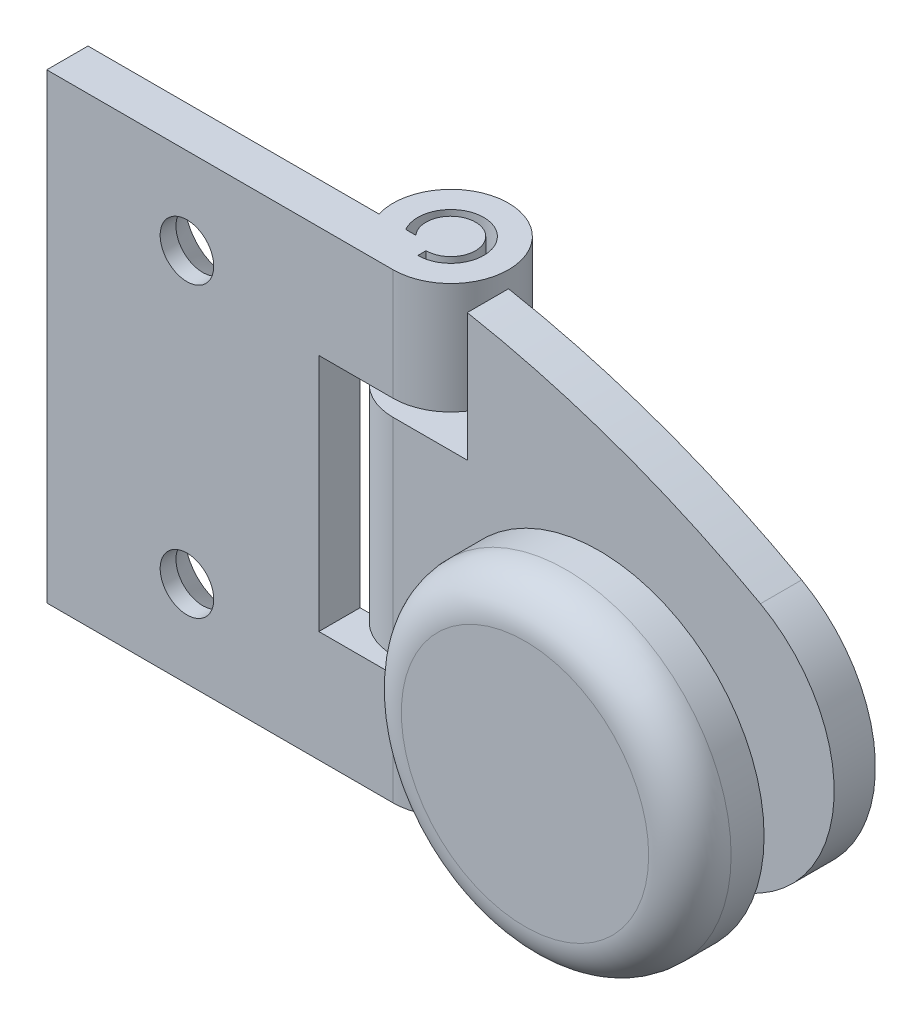
ISO-10303-21;
HEADER;
FILE_DESCRIPTION(('STEP AP214'),'2;1');
FILE_NAME('part.step','',(''),(''),'','','');
FILE_SCHEMA(('AUTOMOTIVE_DESIGN { 1 0 10303 214 1 1 1 1 }'));
ENDSEC;
DATA;
#1=APPLICATION_CONTEXT('core data for automotive mechanical design processes');
#2=APPLICATION_PROTOCOL_DEFINITION('international standard','automotive_design',2000,#1);
#3=PRODUCT_CONTEXT('',#1,'mechanical');
#4=PRODUCT('Part','Part','',(#3));
#5=PRODUCT_RELATED_PRODUCT_CATEGORY('part','',(#4));
#6=PRODUCT_DEFINITION_FORMATION('','',#4);
#7=PRODUCT_DEFINITION_CONTEXT('part definition',#1,'design');
#8=PRODUCT_DEFINITION('design','',#6,#7);
#9=PRODUCT_DEFINITION_SHAPE('','',#8);
#10=(LENGTH_UNIT() NAMED_UNIT(*) SI_UNIT(.MILLI.,.METRE.));
#11=(NAMED_UNIT(*) PLANE_ANGLE_UNIT() SI_UNIT($,.RADIAN.));
#12=(NAMED_UNIT(*) SI_UNIT($,.STERADIAN.) SOLID_ANGLE_UNIT());
#13=UNCERTAINTY_MEASURE_WITH_UNIT(LENGTH_MEASURE(1.E-05),#10,'distance_accuracy_value','');
#14=(GEOMETRIC_REPRESENTATION_CONTEXT(3) GLOBAL_UNCERTAINTY_ASSIGNED_CONTEXT((#13)) GLOBAL_UNIT_ASSIGNED_CONTEXT((#10,
#11,#12)) REPRESENTATION_CONTEXT('',''));
#15=CARTESIAN_POINT('',(0.,0.,0.));
#16=DIRECTION('',(0.,0.,1.));
#17=DIRECTION('',(1.,0.,0.));
#18=AXIS2_PLACEMENT_3D('',#15,#16,#17);
#19=CARTESIAN_POINT('',(0.,28.,2.));
#20=DIRECTION('',(0.,0.,-1.));
#21=DIRECTION('',(-1.,0.,0.));
#22=AXIS2_PLACEMENT_3D('',#19,#20,#21);
#23=PLANE('',#22);
#24=CARTESIAN_POINT('',(-25.,-17.5,2.));
#25=DIRECTION('',(0.,0.,-1.));
#26=DIRECTION('',(-1.,0.,0.));
#27=AXIS2_PLACEMENT_3D('',#24,#25,#26);
#28=CIRCLE('',#27,5.25);
#29=CARTESIAN_POINT('',(-30.25,-17.5,2.));
#30=VERTEX_POINT('',#29);
#31=EDGE_CURVE('E50',#30,#30,#28,.F.);
#32=ORIENTED_EDGE('',*,*,#31,.T.);
#33=EDGE_LOOP('',(#32));
#34=FACE_BOUND('',#33,.T.);
#35=CARTESIAN_POINT('',(-25.,17.5,2.));
#36=DIRECTION('',(0.,0.,-1.));
#37=DIRECTION('',(-1.,0.,0.));
#38=AXIS2_PLACEMENT_3D('',#35,#36,#37);
#39=CIRCLE('',#38,5.25);
#40=CARTESIAN_POINT('',(-30.25,17.5,2.));
#41=VERTEX_POINT('',#40);
#42=EDGE_CURVE('E237',#41,#41,#39,.F.);
#43=ORIENTED_EDGE('',*,*,#42,.T.);
#44=EDGE_LOOP('',(#43));
#45=FACE_BOUND('',#44,.T.);
#46=DIRECTION('',(-1.,0.,0.));
#47=VECTOR('',#46,1.);
#48=CARTESIAN_POINT('',(0.,28.,2.));
#49=LINE('',#48,#47);
#50=CARTESIAN_POINT('',(-6.70820393249937,28.,2.));
#51=VERTEX_POINT('',#50);
#52=CARTESIAN_POINT('',(-42.,28.,2.));
#53=VERTEX_POINT('',#52);
#54=EDGE_CURVE('E181',#51,#53,#49,.T.);
#55=ORIENTED_EDGE('',*,*,#54,.F.);
#56=DIRECTION('',(0.,-1.,0.));
#57=VECTOR('',#56,1.);
#58=CARTESIAN_POINT('',(-6.70820393249937,28.,2.));
#59=LINE('',#58,#57);
#60=CARTESIAN_POINT('',(-6.70820393249937,14.5,2.));
#61=VERTEX_POINT('',#60);
#62=EDGE_CURVE('E167',#51,#61,#59,.T.);
#63=ORIENTED_EDGE('',*,*,#62,.T.);
#64=DIRECTION('',(1.,0.,0.));
#65=VECTOR('',#64,1.);
#66=CARTESIAN_POINT('',(0.,14.5,2.));
#67=LINE('',#66,#65);
#68=CARTESIAN_POINT('',(-9.,14.5,2.));
#69=VERTEX_POINT('',#68);
#70=EDGE_CURVE('E138',#69,#61,#67,.T.);
#71=ORIENTED_EDGE('',*,*,#70,.F.);
#72=DIRECTION('',(0.,1.,0.));
#73=VECTOR('',#72,1.);
#74=CARTESIAN_POINT('',(-9.,14.5,2.));
#75=LINE('',#74,#73);
#76=CARTESIAN_POINT('',(-9.,-14.5,2.));
#77=VERTEX_POINT('',#76);
#78=EDGE_CURVE('E139',#77,#69,#75,.T.);
#79=ORIENTED_EDGE('',*,*,#78,.F.);
#80=DIRECTION('',(-1.,0.,0.));
#81=VECTOR('',#80,1.);
#82=CARTESIAN_POINT('',(-9.,-14.5,2.));
#83=LINE('',#82,#81);
#84=CARTESIAN_POINT('',(-6.70820393249937,-14.5,2.));
#85=VERTEX_POINT('',#84);
#86=EDGE_CURVE('E187',#85,#77,#83,.T.);
#87=ORIENTED_EDGE('',*,*,#86,.F.);
#88=DIRECTION('',(0.,1.,0.));
#89=VECTOR('',#88,1.);
#90=CARTESIAN_POINT('',(-6.70820393249937,-28.,2.));
#91=LINE('',#90,#89);
#92=CARTESIAN_POINT('',(-6.70820393249937,-28.,2.));
#93=VERTEX_POINT('',#92);
#94=EDGE_CURVE('E218',#93,#85,#91,.T.);
#95=ORIENTED_EDGE('',*,*,#94,.F.);
#96=DIRECTION('',(1.,0.,0.));
#97=VECTOR('',#96,1.);
#98=CARTESIAN_POINT('',(0.,-28.,2.));
#99=LINE('',#98,#97);
#100=CARTESIAN_POINT('',(-42.,-28.,2.));
#101=VERTEX_POINT('',#100);
#102=EDGE_CURVE('E184',#101,#93,#99,.T.);
#103=ORIENTED_EDGE('',*,*,#102,.F.);
#104=DIRECTION('',(0.,-1.,0.));
#105=VECTOR('',#104,1.);
#106=CARTESIAN_POINT('',(-42.,28.,2.));
#107=LINE('',#106,#105);
#108=EDGE_CURVE('E180',#53,#101,#107,.T.);
#109=ORIENTED_EDGE('',*,*,#108,.F.);
#110=EDGE_LOOP('',(#55,#63,#71,#79,#87,#95,#103,#109));
#111=FACE_BOUND('',#110,.T.);
#112=ADVANCED_FACE('F42',(#34,#45,#111),#23,.T.);
#113=DIRECTION('',(0.,1.,0.));
#114=VECTOR('',#113,1.);
#115=CARTESIAN_POINT('',(-2.23606797749979,-36.4852813742386,2.));
#116=LINE('',#115,#114);
#117=CARTESIAN_POINT('',(-2.23606797749979,14.5,2.));
#118=VERTEX_POINT('',#117);
#119=CARTESIAN_POINT('',(-2.23606797749979,28.,2.));
#120=VERTEX_POINT('',#119);
#121=EDGE_CURVE('E142',#118,#120,#116,.T.);
#122=ORIENTED_EDGE('',*,*,#121,.F.);
#123=CARTESIAN_POINT('',(-3.46410161513775,14.5,2.));
#124=VERTEX_POINT('',#123);
#125=EDGE_CURVE('E130',#124,#118,#67,.T.);
#126=ORIENTED_EDGE('',*,*,#125,.F.);
#127=DIRECTION('',(0.,1.,0.));
#128=VECTOR('',#127,1.);
#129=CARTESIAN_POINT('',(-3.46410161513775,-28.,2.));
#130=LINE('',#129,#128);
#131=CARTESIAN_POINT('',(-3.46410161513775,28.,2.));
#132=VERTEX_POINT('',#131);
#133=EDGE_CURVE('E176',#124,#132,#130,.T.);
#134=ORIENTED_EDGE('',*,*,#133,.T.);
#135=EDGE_CURVE('E144',#120,#132,#49,.T.);
#136=ORIENTED_EDGE('',*,*,#135,.F.);
#137=EDGE_LOOP('',(#122,#126,#134,#136));
#138=FACE_BOUND('',#137,.T.);
#139=ADVANCED_FACE('F143',(#138),#23,.T.);
#140=CARTESIAN_POINT('',(0.,28.,2.));
#141=DIRECTION('',(1.,0.,0.));
#142=DIRECTION('',(0.,1.,0.));
#143=AXIS2_PLACEMENT_3D('',#140,#141,#142);
#144=PLANE('',#143);
#145=DIRECTION('',(0.,1.,0.));
#146=VECTOR('',#145,1.);
#147=CARTESIAN_POINT('',(0.,-36.4852813742386,3.));
#148=LINE('',#147,#146);
#149=CARTESIAN_POINT('',(0.,28.,3.));
#150=VERTEX_POINT('',#149);
#151=CARTESIAN_POINT('',(0.,14.5,3.));
#152=VERTEX_POINT('',#151);
#153=EDGE_CURVE('E64',#150,#152,#148,.F.);
#154=ORIENTED_EDGE('',*,*,#153,.F.);
#155=DIRECTION('',(0.,0.,1.));
#156=VECTOR('',#155,1.);
#157=CARTESIAN_POINT('',(0.,28.,2.));
#158=LINE('',#157,#156);
#159=CARTESIAN_POINT('',(0.,28.,4.));
#160=VERTEX_POINT('',#159);
#161=EDGE_CURVE('E192',#150,#160,#158,.T.);
#162=ORIENTED_EDGE('',*,*,#161,.T.);
#163=DIRECTION('',(0.,1.,0.));
#164=VECTOR('',#163,1.);
#165=CARTESIAN_POINT('',(0.,-28.,4.));
#166=LINE('',#165,#164);
#167=CARTESIAN_POINT('',(0.,14.5,4.));
#168=VERTEX_POINT('',#167);
#169=EDGE_CURVE('E173',#160,#168,#166,.F.);
#170=ORIENTED_EDGE('',*,*,#169,.T.);
#171=DIRECTION('',(0.,0.,1.));
#172=VECTOR('',#171,1.);
#173=CARTESIAN_POINT('',(0.,14.5,2.));
#174=LINE('',#173,#172);
#175=EDGE_CURVE('E216',#152,#168,#174,.T.);
#176=ORIENTED_EDGE('',*,*,#175,.F.);
#177=EDGE_LOOP('',(#154,#162,#170,#176));
#178=FACE_BOUND('',#177,.T.);
#179=ADVANCED_FACE('F278',(#178),#144,.T.);
#180=CARTESIAN_POINT('',(0.,-28.,0.));
#181=DIRECTION('',(0.,1.,0.));
#182=DIRECTION('',(0.,0.,1.));
#183=AXIS2_PLACEMENT_3D('',#180,#181,#182);
#184=CYLINDRICAL_SURFACE('',#183,7.);
#185=CARTESIAN_POINT('',(0.,-28.,0.));
#186=DIRECTION('',(0.,-1.,0.));
#187=DIRECTION('',(0.,0.,-1.));
#188=AXIS2_PLACEMENT_3D('',#185,#186,#187);
#189=CIRCLE('',#188,7.);
#190=CARTESIAN_POINT('',(0.,-28.,7.));
#191=VERTEX_POINT('',#190);
#192=EDGE_CURVE('E230',#93,#191,#189,.T.);
#193=ORIENTED_EDGE('',*,*,#192,.F.);
#194=ORIENTED_EDGE('',*,*,#94,.T.);
#195=CARTESIAN_POINT('',(0.,-14.5,0.));
#196=DIRECTION('',(0.,-1.,0.));
#197=DIRECTION('',(0.,0.,-1.));
#198=AXIS2_PLACEMENT_3D('',#195,#196,#197);
#199=CIRCLE('',#198,7.);
#200=CARTESIAN_POINT('',(0.,-14.5,7.));
#201=VERTEX_POINT('',#200);
#202=EDGE_CURVE('E229',#85,#201,#199,.T.);
#203=ORIENTED_EDGE('',*,*,#202,.T.);
#204=DIRECTION('',(0.,1.,0.));
#205=VECTOR('',#204,1.);
#206=CARTESIAN_POINT('',(0.,-28.,7.));
#207=LINE('',#206,#205);
#208=EDGE_CURVE('E204',#191,#201,#207,.T.);
#209=ORIENTED_EDGE('',*,*,#208,.F.);
#210=EDGE_LOOP('',(#193,#194,#203,#209));
#211=FACE_BOUND('',#210,.T.);
#212=ADVANCED_FACE('F302',(#211),#184,.T.);
#213=CARTESIAN_POINT('',(0.,-28.,0.));
#214=DIRECTION('',(0.,-1.,0.));
#215=DIRECTION('',(0.,0.,-1.));
#216=AXIS2_PLACEMENT_3D('',#213,#214,#215);
#217=PLANE('',#216);
#218=ORIENTED_EDGE('',*,*,#192,.T.);
#219=DIRECTION('',(1.,0.,0.));
#220=VECTOR('',#219,1.);
#221=CARTESIAN_POINT('',(0.,-28.,7.));
#222=LINE('',#221,#220);
#223=CARTESIAN_POINT('',(-42.,-28.,7.));
#224=VERTEX_POINT('',#223);
#225=EDGE_CURVE('E201',#224,#191,#222,.T.);
#226=ORIENTED_EDGE('',*,*,#225,.F.);
#227=DIRECTION('',(0.,0.,1.));
#228=VECTOR('',#227,1.);
#229=CARTESIAN_POINT('',(-42.,-28.,2.));
#230=LINE('',#229,#228);
#231=EDGE_CURVE('E223',#101,#224,#230,.T.);
#232=ORIENTED_EDGE('',*,*,#231,.F.);
#233=ORIENTED_EDGE('',*,*,#102,.T.);
#234=EDGE_LOOP('',(#218,#226,#232,#233));
#235=FACE_BOUND('',#234,.T.);
#236=ADVANCED_FACE('F303',(#235),#217,.T.);
#237=CARTESIAN_POINT('',(0.,-14.5,0.));
#238=DIRECTION('',(0.,-1.,0.));
#239=DIRECTION('',(0.,0.,-1.));
#240=AXIS2_PLACEMENT_3D('',#237,#238,#239);
#241=PLANE('',#240);
#242=CARTESIAN_POINT('',(0.,-14.5,0.));
#243=DIRECTION('',(0.,-1.,0.));
#244=DIRECTION('',(0.,0.,-1.));
#245=AXIS2_PLACEMENT_3D('',#242,#243,#244);
#246=CIRCLE('',#245,3.);
#247=CARTESIAN_POINT('',(0.,-14.5,-3.));
#248=VERTEX_POINT('',#247);
#249=EDGE_CURVE('E148',#248,#248,#246,.T.);
#250=ORIENTED_EDGE('',*,*,#249,.T.);
#251=EDGE_LOOP('',(#250));
#252=FACE_BOUND('',#251,.T.);
#253=ORIENTED_EDGE('',*,*,#202,.F.);
#254=ORIENTED_EDGE('',*,*,#86,.T.);
#255=DIRECTION('',(0.,0.,1.));
#256=VECTOR('',#255,1.);
#257=CARTESIAN_POINT('',(-9.,-14.5,2.));
#258=LINE('',#257,#256);
#259=CARTESIAN_POINT('',(-9.,-14.5,7.));
#260=VERTEX_POINT('',#259);
#261=EDGE_CURVE('E221',#77,#260,#258,.T.);
#262=ORIENTED_EDGE('',*,*,#261,.T.);
#263=DIRECTION('',(-1.,0.,0.));
#264=VECTOR('',#263,1.);
#265=CARTESIAN_POINT('',(-9.,-14.5,7.));
#266=LINE('',#265,#264);
#267=EDGE_CURVE('E207',#201,#260,#266,.T.);
#268=ORIENTED_EDGE('',*,*,#267,.F.);
#269=EDGE_LOOP('',(#253,#254,#262,#268));
#270=FACE_BOUND('',#269,.T.);
#271=ADVANCED_FACE('F289',(#252,#270),#241,.F.);
#272=CARTESIAN_POINT('',(0.,14.5,2.));
#273=DIRECTION('',(0.,-1.,0.));
#274=DIRECTION('',(1.,0.,0.));
#275=AXIS2_PLACEMENT_3D('',#272,#273,#274);
#276=PLANE('',#275);
#277=CARTESIAN_POINT('',(0.,14.5,0.));
#278=DIRECTION('',(0.,-1.,0.));
#279=DIRECTION('',(1.,0.,0.));
#280=AXIS2_PLACEMENT_3D('',#277,#278,#279);
#281=CIRCLE('',#280,3.);
#282=EDGE_CURVE('E57',#152,#118,#281,.T.);
#283=ORIENTED_EDGE('',*,*,#282,.F.);
#284=ORIENTED_EDGE('',*,*,#175,.T.);
#285=CARTESIAN_POINT('',(0.,14.5,0.));
#286=DIRECTION('',(0.,1.,0.));
#287=DIRECTION('',(0.,0.,1.));
#288=AXIS2_PLACEMENT_3D('',#285,#286,#287);
#289=CIRCLE('',#288,4.);
#290=EDGE_CURVE('E135',#168,#124,#289,.T.);
#291=ORIENTED_EDGE('',*,*,#290,.T.);
#292=ORIENTED_EDGE('',*,*,#125,.T.);
#293=EDGE_LOOP('',(#283,#284,#291,#292));
#294=FACE_BOUND('',#293,.T.);
#295=ORIENTED_EDGE('',*,*,#70,.T.);
#296=CARTESIAN_POINT('',(0.,14.5,0.));
#297=DIRECTION('',(0.,1.,0.));
#298=DIRECTION('',(0.,0.,1.));
#299=AXIS2_PLACEMENT_3D('',#296,#297,#298);
#300=CIRCLE('',#299,7.);
#301=CARTESIAN_POINT('',(0.,14.5,7.));
#302=VERTEX_POINT('',#301);
#303=EDGE_CURVE('E168',#302,#61,#300,.T.);
#304=ORIENTED_EDGE('',*,*,#303,.F.);
#305=DIRECTION('',(1.,0.,0.));
#306=VECTOR('',#305,1.);
#307=CARTESIAN_POINT('',(0.,14.5,7.));
#308=LINE('',#307,#306);
#309=CARTESIAN_POINT('',(-9.,14.5,7.));
#310=VERTEX_POINT('',#309);
#311=EDGE_CURVE('E213',#310,#302,#308,.T.);
#312=ORIENTED_EDGE('',*,*,#311,.F.);
#313=DIRECTION('',(0.,0.,1.));
#314=VECTOR('',#313,1.);
#315=CARTESIAN_POINT('',(-9.,14.5,2.));
#316=LINE('',#315,#314);
#317=EDGE_CURVE('E219',#69,#310,#316,.T.);
#318=ORIENTED_EDGE('',*,*,#317,.F.);
#319=EDGE_LOOP('',(#295,#304,#312,#318));
#320=FACE_BOUND('',#319,.T.);
#321=ADVANCED_FACE('F132',(#294,#320),#276,.T.);
#322=CARTESIAN_POINT('',(-9.,14.5,2.));
#323=DIRECTION('',(1.,0.,0.));
#324=DIRECTION('',(0.,1.,0.));
#325=AXIS2_PLACEMENT_3D('',#322,#323,#324);
#326=PLANE('',#325);
#327=DIRECTION('',(0.,1.,0.));
#328=VECTOR('',#327,1.);
#329=CARTESIAN_POINT('',(-9.,14.5,7.));
#330=LINE('',#329,#328);
#331=EDGE_CURVE('E210',#260,#310,#330,.T.);
#332=ORIENTED_EDGE('',*,*,#331,.F.);
#333=ORIENTED_EDGE('',*,*,#261,.F.);
#334=ORIENTED_EDGE('',*,*,#78,.T.);
#335=ORIENTED_EDGE('',*,*,#317,.T.);
#336=EDGE_LOOP('',(#332,#333,#334,#335));
#337=FACE_BOUND('',#336,.T.);
#338=ADVANCED_FACE('F288',(#337),#326,.T.);
#339=CARTESIAN_POINT('',(-42.,28.,2.));
#340=DIRECTION('',(-1.,0.,0.));
#341=DIRECTION('',(0.,-1.,0.));
#342=AXIS2_PLACEMENT_3D('',#339,#340,#341);
#343=PLANE('',#342);
#344=DIRECTION('',(0.,-1.,0.));
#345=VECTOR('',#344,1.);
#346=CARTESIAN_POINT('',(-42.,28.,7.));
#347=LINE('',#346,#345);
#348=CARTESIAN_POINT('',(-42.,28.,7.));
#349=VERTEX_POINT('',#348);
#350=EDGE_CURVE('E198',#349,#224,#347,.T.);
#351=ORIENTED_EDGE('',*,*,#350,.F.);
#352=DIRECTION('',(0.,0.,1.));
#353=VECTOR('',#352,1.);
#354=CARTESIAN_POINT('',(-42.,28.,2.));
#355=LINE('',#354,#353);
#356=EDGE_CURVE('E225',#53,#349,#355,.T.);
#357=ORIENTED_EDGE('',*,*,#356,.F.);
#358=ORIENTED_EDGE('',*,*,#108,.T.);
#359=ORIENTED_EDGE('',*,*,#231,.T.);
#360=EDGE_LOOP('',(#351,#357,#358,#359));
#361=FACE_BOUND('',#360,.T.);
#362=ADVANCED_FACE('F292',(#361),#343,.T.);
#363=CARTESIAN_POINT('',(0.,28.,2.));
#364=DIRECTION('',(0.,1.,0.));
#365=DIRECTION('',(-1.,0.,0.));
#366=AXIS2_PLACEMENT_3D('',#363,#364,#365);
#367=PLANE('',#366);
#368=CARTESIAN_POINT('',(0.,28.,0.));
#369=DIRECTION('',(0.,1.,0.));
#370=DIRECTION('',(0.,0.,1.));
#371=AXIS2_PLACEMENT_3D('',#368,#369,#370);
#372=CIRCLE('',#371,3.);
#373=EDGE_CURVE('E152',#150,#120,#372,.T.);
#374=ORIENTED_EDGE('',*,*,#373,.T.);
#375=ORIENTED_EDGE('',*,*,#135,.T.);
#376=CARTESIAN_POINT('',(0.,28.,0.));
#377=DIRECTION('',(0.,1.,0.));
#378=DIRECTION('',(0.,0.,1.));
#379=AXIS2_PLACEMENT_3D('',#376,#377,#378);
#380=CIRCLE('',#379,4.);
#381=EDGE_CURVE('E161',#160,#132,#380,.T.);
#382=ORIENTED_EDGE('',*,*,#381,.F.);
#383=ORIENTED_EDGE('',*,*,#161,.F.);
#384=EDGE_LOOP('',(#374,#375,#382,#383));
#385=FACE_BOUND('',#384,.T.);
#386=CARTESIAN_POINT('',(0.,28.,0.));
#387=DIRECTION('',(0.,1.,0.));
#388=DIRECTION('',(0.,0.,1.));
#389=AXIS2_PLACEMENT_3D('',#386,#387,#388);
#390=CIRCLE('',#389,7.);
#391=CARTESIAN_POINT('',(0.,28.,7.));
#392=VERTEX_POINT('',#391);
#393=EDGE_CURVE('E164',#392,#51,#390,.T.);
#394=ORIENTED_EDGE('',*,*,#393,.T.);
#395=ORIENTED_EDGE('',*,*,#54,.T.);
#396=ORIENTED_EDGE('',*,*,#356,.T.);
#397=DIRECTION('',(-1.,0.,0.));
#398=VECTOR('',#397,1.);
#399=CARTESIAN_POINT('',(0.,28.,7.));
#400=LINE('',#399,#398);
#401=EDGE_CURVE('E195',#392,#349,#400,.T.);
#402=ORIENTED_EDGE('',*,*,#401,.F.);
#403=EDGE_LOOP('',(#394,#395,#396,#402));
#404=FACE_BOUND('',#403,.T.);
#405=ADVANCED_FACE('F285',(#385,#404),#367,.T.);
#406=CARTESIAN_POINT('',(0.,28.,7.));
#407=DIRECTION('',(0.,0.,-1.));
#408=DIRECTION('',(-1.,0.,0.));
#409=AXIS2_PLACEMENT_3D('',#406,#407,#408);
#410=PLANE('',#409);
#411=CARTESIAN_POINT('',(-25.,-17.5,7.));
#412=DIRECTION('',(0.,0.,-1.));
#413=DIRECTION('',(-1.,0.,0.));
#414=AXIS2_PLACEMENT_3D('',#411,#412,#413);
#415=CIRCLE('',#414,3.25);
#416=CARTESIAN_POINT('',(-28.25,-17.5,7.));
#417=VERTEX_POINT('',#416);
#418=EDGE_CURVE('E256',#417,#417,#415,.T.);
#419=ORIENTED_EDGE('',*,*,#418,.T.);
#420=EDGE_LOOP('',(#419));
#421=FACE_BOUND('',#420,.T.);
#422=CARTESIAN_POINT('',(-25.,17.5,7.));
#423=DIRECTION('',(0.,0.,-1.));
#424=DIRECTION('',(-1.,0.,0.));
#425=AXIS2_PLACEMENT_3D('',#422,#423,#424);
#426=CIRCLE('',#425,3.25);
#427=CARTESIAN_POINT('',(-28.25,17.5,7.));
#428=VERTEX_POINT('',#427);
#429=EDGE_CURVE('E155',#428,#428,#426,.T.);
#430=ORIENTED_EDGE('',*,*,#429,.T.);
#431=EDGE_LOOP('',(#430));
#432=FACE_BOUND('',#431,.T.);
#433=DIRECTION('',(0.,1.,0.));
#434=VECTOR('',#433,1.);
#435=CARTESIAN_POINT('',(0.,28.,7.));
#436=LINE('',#435,#434);
#437=EDGE_CURVE('E178',#302,#392,#436,.T.);
#438=ORIENTED_EDGE('',*,*,#437,.T.);
#439=ORIENTED_EDGE('',*,*,#401,.T.);
#440=ORIENTED_EDGE('',*,*,#350,.T.);
#441=ORIENTED_EDGE('',*,*,#225,.T.);
#442=ORIENTED_EDGE('',*,*,#208,.T.);
#443=ORIENTED_EDGE('',*,*,#267,.T.);
#444=ORIENTED_EDGE('',*,*,#331,.T.);
#445=ORIENTED_EDGE('',*,*,#311,.T.);
#446=EDGE_LOOP('',(#438,#439,#440,#441,#442,#443,#444,#445));
#447=FACE_BOUND('',#446,.T.);
#448=ADVANCED_FACE('F262',(#421,#432,#447),#410,.F.);
#449=CARTESIAN_POINT('',(0.,28.,0.));
#450=DIRECTION('',(0.,-1.,0.));
#451=DIRECTION('',(0.,0.,-1.));
#452=AXIS2_PLACEMENT_3D('',#449,#450,#451);
#453=CYLINDRICAL_SURFACE('',#452,7.);
#454=ORIENTED_EDGE('',*,*,#62,.F.);
#455=ORIENTED_EDGE('',*,*,#393,.F.);
#456=ORIENTED_EDGE('',*,*,#437,.F.);
#457=ORIENTED_EDGE('',*,*,#303,.T.);
#458=EDGE_LOOP('',(#454,#455,#456,#457));
#459=FACE_BOUND('',#458,.T.);
#460=ADVANCED_FACE('F281',(#459),#453,.T.);
#461=CARTESIAN_POINT('',(0.,-28.,0.));
#462=DIRECTION('',(0.,1.,0.));
#463=DIRECTION('',(0.,0.,1.));
#464=AXIS2_PLACEMENT_3D('',#461,#462,#463);
#465=CYLINDRICAL_SURFACE('',#464,4.);
#466=ORIENTED_EDGE('',*,*,#133,.F.);
#467=ORIENTED_EDGE('',*,*,#290,.F.);
#468=ORIENTED_EDGE('',*,*,#169,.F.);
#469=ORIENTED_EDGE('',*,*,#381,.T.);
#470=EDGE_LOOP('',(#466,#467,#468,#469));
#471=FACE_BOUND('',#470,.T.);
#472=ADVANCED_FACE('F271',(#471),#465,.F.);
#473=CARTESIAN_POINT('',(0.,-36.4852813742386,0.));
#474=DIRECTION('',(0.,1.,0.));
#475=DIRECTION('',(0.,0.,1.));
#476=AXIS2_PLACEMENT_3D('',#473,#474,#475);
#477=CYLINDRICAL_SURFACE('',#476,3.);
#478=ORIENTED_EDGE('',*,*,#282,.T.);
#479=ORIENTED_EDGE('',*,*,#121,.T.);
#480=ORIENTED_EDGE('',*,*,#373,.F.);
#481=ORIENTED_EDGE('',*,*,#153,.T.);
#482=EDGE_LOOP('',(#478,#479,#480,#481));
#483=FACE_BOUND('',#482,.T.);
#484=ORIENTED_EDGE('',*,*,#249,.F.);
#485=EDGE_LOOP('',(#484));
#486=FACE_BOUND('',#485,.T.);
#487=ADVANCED_FACE('F150',(#483,#486),#477,.T.);
#488=CARTESIAN_POINT('',(-25.,17.5,7.));
#489=DIRECTION('',(0.,0.,-1.));
#490=DIRECTION('',(-1.,0.,0.));
#491=AXIS2_PLACEMENT_3D('',#488,#489,#490);
#492=CYLINDRICAL_SURFACE('',#491,3.25);
#493=CARTESIAN_POINT('',(-25.,17.5,5.07972992762917));
#494=DIRECTION('',(0.,0.,-1.));
#495=DIRECTION('',(-1.,0.,0.));
#496=AXIS2_PLACEMENT_3D('',#493,#494,#495);
#497=CIRCLE('',#496,3.25);
#498=CARTESIAN_POINT('',(-28.25,17.5,5.07972992762917));
#499=VERTEX_POINT('',#498);
#500=EDGE_CURVE('E12',#499,#499,#497,.T.);
#501=ORIENTED_EDGE('',*,*,#500,.T.);
#502=EDGE_LOOP('',(#501));
#503=FACE_BOUND('',#502,.T.);
#504=ORIENTED_EDGE('',*,*,#429,.F.);
#505=EDGE_LOOP('',(#504));
#506=FACE_BOUND('',#505,.T.);
#507=ADVANCED_FACE('F252',(#503,#506),#492,.F.);
#508=CARTESIAN_POINT('',(-25.,-17.5,7.));
#509=DIRECTION('',(0.,0.,-1.));
#510=DIRECTION('',(-1.,0.,0.));
#511=AXIS2_PLACEMENT_3D('',#508,#509,#510);
#512=CYLINDRICAL_SURFACE('',#511,3.25);
#513=CARTESIAN_POINT('',(-25.,-17.5,5.07972992762917));
#514=DIRECTION('',(0.,0.,-1.));
#515=DIRECTION('',(-1.,0.,0.));
#516=AXIS2_PLACEMENT_3D('',#513,#514,#515);
#517=CIRCLE('',#516,3.25);
#518=CARTESIAN_POINT('',(-28.25,-17.5,5.07972992762917));
#519=VERTEX_POINT('',#518);
#520=EDGE_CURVE('E233',#519,#519,#517,.T.);
#521=ORIENTED_EDGE('',*,*,#520,.T.);
#522=EDGE_LOOP('',(#521));
#523=FACE_BOUND('',#522,.T.);
#524=ORIENTED_EDGE('',*,*,#418,.F.);
#525=EDGE_LOOP('',(#524));
#526=FACE_BOUND('',#525,.T.);
#527=ADVANCED_FACE('F247',(#523,#526),#512,.F.);
#528=CARTESIAN_POINT('',(-25.,-17.5,5.07972992762917));
#529=DIRECTION('',(0.,0.,-1.));
#530=DIRECTION('',(-1.,0.,0.));
#531=AXIS2_PLACEMENT_3D('',#528,#529,#530);
#532=CONICAL_SURFACE('',#531,3.25,0.575958653158129);
#533=ORIENTED_EDGE('',*,*,#31,.F.);
#534=EDGE_LOOP('',(#533));
#535=FACE_BOUND('',#534,.T.);
#536=ORIENTED_EDGE('',*,*,#520,.F.);
#537=EDGE_LOOP('',(#536));
#538=FACE_BOUND('',#537,.T.);
#539=ADVANCED_FACE('F244',(#535,#538),#532,.F.);
#540=CARTESIAN_POINT('',(-25.,17.5,5.07972992762917));
#541=DIRECTION('',(0.,0.,-1.));
#542=DIRECTION('',(-1.,0.,0.));
#543=AXIS2_PLACEMENT_3D('',#540,#541,#542);
#544=CONICAL_SURFACE('',#543,3.25,0.575958653158129);
#545=ORIENTED_EDGE('',*,*,#42,.F.);
#546=EDGE_LOOP('',(#545));
#547=FACE_BOUND('',#546,.T.);
#548=ORIENTED_EDGE('',*,*,#500,.F.);
#549=EDGE_LOOP('',(#548));
#550=FACE_BOUND('',#549,.T.);
#551=ADVANCED_FACE('F44',(#547,#550),#544,.F.);
#552=CLOSED_SHELL('',(#112,#139,#179,#212,#236,#271,#321,#338,#362,#405,#448,#460,#472,#487,
#507,#527,#539,#551));
#553=MANIFOLD_SOLID_BREP('B2',#552);
#554=CARTESIAN_POINT('',(0.,-12.5,0.));
#555=DIRECTION('',(0.,1.,0.));
#556=DIRECTION('',(0.,0.,1.));
#557=AXIS2_PLACEMENT_3D('',#554,#555,#556);
#558=CYLINDRICAL_SURFACE('',#557,7.);
#559=DIRECTION('',(0.,1.,0.));
#560=VECTOR('',#559,1.);
#561=CARTESIAN_POINT('',(6.70820393249937,-12.5,2.));
#562=LINE('',#561,#560);
#563=CARTESIAN_POINT('',(6.70820393249937,-12.5,2.));
#564=VERTEX_POINT('',#563);
#565=CARTESIAN_POINT('',(6.70820393249937,12.5,2.));
#566=VERTEX_POINT('',#565);
#567=EDGE_CURVE('E480',#564,#566,#562,.T.);
#568=ORIENTED_EDGE('',*,*,#567,.F.);
#569=CARTESIAN_POINT('',(0.,-12.5,0.));
#570=DIRECTION('',(0.,1.,0.));
#571=DIRECTION('',(0.,0.,1.));
#572=AXIS2_PLACEMENT_3D('',#569,#570,#571);
#573=CIRCLE('',#572,7.);
#574=CARTESIAN_POINT('',(0.,-12.5,7.));
#575=VERTEX_POINT('',#574);
#576=EDGE_CURVE('E533',#564,#575,#573,.T.);
#577=ORIENTED_EDGE('',*,*,#576,.T.);
#578=DIRECTION('',(0.,-1.,0.));
#579=VECTOR('',#578,1.);
#580=CARTESIAN_POINT('',(0.,12.5,7.));
#581=LINE('',#580,#579);
#582=CARTESIAN_POINT('',(0.,12.5,7.));
#583=VERTEX_POINT('',#582);
#584=EDGE_CURVE('E568',#583,#575,#581,.T.);
#585=ORIENTED_EDGE('',*,*,#584,.F.);
#586=CARTESIAN_POINT('',(0.,12.5,0.));
#587=DIRECTION('',(0.,1.,0.));
#588=DIRECTION('',(0.,0.,1.));
#589=AXIS2_PLACEMENT_3D('',#586,#587,#588);
#590=CIRCLE('',#589,7.);
#591=EDGE_CURVE('E485',#566,#583,#590,.T.);
#592=ORIENTED_EDGE('',*,*,#591,.F.);
#593=EDGE_LOOP('',(#568,#577,#585,#592));
#594=FACE_BOUND('',#593,.T.);
#595=ADVANCED_FACE('F465',(#594),#558,.T.);
#596=CARTESIAN_POINT('',(0.,-12.5,0.));
#597=DIRECTION('',(0.,1.,0.));
#598=DIRECTION('',(0.,0.,1.));
#599=AXIS2_PLACEMENT_3D('',#596,#597,#598);
#600=PLANE('',#599);
#601=CARTESIAN_POINT('',(0.,-12.5,0.));
#602=DIRECTION('',(0.,1.,0.));
#603=DIRECTION('',(0.,0.,1.));
#604=AXIS2_PLACEMENT_3D('',#601,#602,#603);
#605=CIRCLE('',#604,4.);
#606=CARTESIAN_POINT('',(0.,-12.5,4.));
#607=VERTEX_POINT('',#606);
#608=EDGE_CURVE('E569',#607,#607,#605,.F.);
#609=ORIENTED_EDGE('',*,*,#608,.F.);
#610=EDGE_LOOP('',(#609));
#611=FACE_BOUND('',#610,.T.);
#612=ORIENTED_EDGE('',*,*,#576,.F.);
#613=DIRECTION('',(1.,0.,0.));
#614=VECTOR('',#613,1.);
#615=CARTESIAN_POINT('',(0.,-12.5,2.));
#616=LINE('',#615,#614);
#617=CARTESIAN_POINT('',(9.,-12.5,2.));
#618=VERTEX_POINT('',#617);
#619=EDGE_CURVE('E527',#564,#618,#616,.T.);
#620=ORIENTED_EDGE('',*,*,#619,.T.);
#621=DIRECTION('',(0.,0.,1.));
#622=VECTOR('',#621,1.);
#623=CARTESIAN_POINT('',(9.,-12.5,2.));
#624=LINE('',#623,#622);
#625=CARTESIAN_POINT('',(9.,-12.5,7.));
#626=VERTEX_POINT('',#625);
#627=EDGE_CURVE('E531',#618,#626,#624,.T.);
#628=ORIENTED_EDGE('',*,*,#627,.T.);
#629=DIRECTION('',(1.,0.,0.));
#630=VECTOR('',#629,1.);
#631=CARTESIAN_POINT('',(0.,-12.5,7.));
#632=LINE('',#631,#630);
#633=EDGE_CURVE('E572',#575,#626,#632,.T.);
#634=ORIENTED_EDGE('',*,*,#633,.F.);
#635=EDGE_LOOP('',(#612,#620,#628,#634));
#636=FACE_BOUND('',#635,.T.);
#637=ADVANCED_FACE('F529',(#611,#636),#600,.F.);
#638=CARTESIAN_POINT('',(0.,12.5,0.));
#639=DIRECTION('',(0.,1.,0.));
#640=DIRECTION('',(0.,0.,1.));
#641=AXIS2_PLACEMENT_3D('',#638,#639,#640);
#642=PLANE('',#641);
#643=CARTESIAN_POINT('',(0.,12.5,0.));
#644=DIRECTION('',(0.,1.,0.));
#645=DIRECTION('',(0.,0.,1.));
#646=AXIS2_PLACEMENT_3D('',#643,#644,#645);
#647=CIRCLE('',#646,4.);
#648=CARTESIAN_POINT('',(0.,12.5,4.));
#649=VERTEX_POINT('',#648);
#650=EDGE_CURVE('E680',#649,#649,#647,.T.);
#651=ORIENTED_EDGE('',*,*,#650,.F.);
#652=EDGE_LOOP('',(#651));
#653=FACE_BOUND('',#652,.T.);
#654=ORIENTED_EDGE('',*,*,#591,.T.);
#655=DIRECTION('',(-1.,0.,0.));
#656=VECTOR('',#655,1.);
#657=CARTESIAN_POINT('',(0.,12.5,7.));
#658=LINE('',#657,#656);
#659=CARTESIAN_POINT('',(9.,12.5,7.));
#660=VERTEX_POINT('',#659);
#661=EDGE_CURVE('E565',#660,#583,#658,.T.);
#662=ORIENTED_EDGE('',*,*,#661,.F.);
#663=DIRECTION('',(0.,0.,1.));
#664=VECTOR('',#663,1.);
#665=CARTESIAN_POINT('',(9.,12.5,2.));
#666=LINE('',#665,#664);
#667=CARTESIAN_POINT('',(9.,12.5,2.));
#668=VERTEX_POINT('',#667);
#669=EDGE_CURVE('E587',#668,#660,#666,.T.);
#670=ORIENTED_EDGE('',*,*,#669,.F.);
#671=DIRECTION('',(-1.,0.,0.));
#672=VECTOR('',#671,1.);
#673=CARTESIAN_POINT('',(0.,12.5,2.));
#674=LINE('',#673,#672);
#675=EDGE_CURVE('E537',#668,#566,#674,.T.);
#676=ORIENTED_EDGE('',*,*,#675,.T.);
#677=EDGE_LOOP('',(#654,#662,#670,#676));
#678=FACE_BOUND('',#677,.T.);
#679=ADVANCED_FACE('F623',(#653,#678),#642,.T.);
#680=CARTESIAN_POINT('',(9.,12.5,2.));
#681=DIRECTION('',(-1.,0.,0.));
#682=DIRECTION('',(0.,0.,1.));
#683=AXIS2_PLACEMENT_3D('',#680,#681,#682);
#684=PLANE('',#683);
#685=DIRECTION('',(0.,-1.,0.));
#686=VECTOR('',#685,1.);
#687=CARTESIAN_POINT('',(9.,12.5,7.));
#688=LINE('',#687,#686);
#689=CARTESIAN_POINT('',(9.00000000000001,28.,7.));
#690=VERTEX_POINT('',#689);
#691=EDGE_CURVE('E584',#690,#660,#688,.T.);
#692=ORIENTED_EDGE('',*,*,#691,.F.);
#693=DIRECTION('',(0.,0.,1.));
#694=VECTOR('',#693,1.);
#695=CARTESIAN_POINT('',(9.00000000000001,28.,2.));
#696=LINE('',#695,#694);
#697=CARTESIAN_POINT('',(9.00000000000001,28.,2.));
#698=VERTEX_POINT('',#697);
#699=EDGE_CURVE('E589',#698,#690,#696,.T.);
#700=ORIENTED_EDGE('',*,*,#699,.F.);
#701=DIRECTION('',(0.,-1.,0.));
#702=VECTOR('',#701,1.);
#703=CARTESIAN_POINT('',(9.,12.5,2.));
#704=LINE('',#703,#702);
#705=EDGE_CURVE('E546',#698,#668,#704,.T.);
#706=ORIENTED_EDGE('',*,*,#705,.T.);
#707=ORIENTED_EDGE('',*,*,#669,.T.);
#708=EDGE_LOOP('',(#692,#700,#706,#707));
#709=FACE_BOUND('',#708,.T.);
#710=ADVANCED_FACE('F659',(#709),#684,.T.);
#711=CARTESIAN_POINT('',(-12.5758449380773,-87.6951451964666,2.));
#712=DIRECTION('',(0.,0.,1.));
#713=DIRECTION('',(1.,0.,0.));
#714=AXIS2_PLACEMENT_3D('',#711,#712,#713);
#715=CYLINDRICAL_SURFACE('',#714,117.689777410034);
#716=CARTESIAN_POINT('',(-12.5758449380773,-87.6951451964666,7.));
#717=DIRECTION('',(0.,0.,1.));
#718=DIRECTION('',(-1.,0.,0.));
#719=AXIS2_PLACEMENT_3D('',#716,#717,#718);
#720=CIRCLE('',#719,117.689777410034);
#721=CARTESIAN_POINT('',(44.555285148779,15.1976032449185,7.));
#722=VERTEX_POINT('',#721);
#723=EDGE_CURVE('E581',#722,#690,#720,.T.);
#724=ORIENTED_EDGE('',*,*,#723,.F.);
#725=DIRECTION('',(0.,0.,1.));
#726=VECTOR('',#725,1.);
#727=CARTESIAN_POINT('',(44.555285148779,15.1976032449185,2.));
#728=LINE('',#727,#726);
#729=CARTESIAN_POINT('',(44.555285148779,15.1976032449185,2.));
#730=VERTEX_POINT('',#729);
#731=EDGE_CURVE('E591',#730,#722,#728,.T.);
#732=ORIENTED_EDGE('',*,*,#731,.F.);
#733=CARTESIAN_POINT('',(-12.5758449380773,-87.6951451964666,2.));
#734=DIRECTION('',(0.,0.,1.));
#735=DIRECTION('',(-1.,0.,0.));
#736=AXIS2_PLACEMENT_3D('',#733,#734,#735);
#737=CIRCLE('',#736,117.689777410034);
#738=EDGE_CURVE('E560',#730,#698,#737,.T.);
#739=ORIENTED_EDGE('',*,*,#738,.T.);
#740=ORIENTED_EDGE('',*,*,#699,.T.);
#741=EDGE_LOOP('',(#724,#732,#739,#740));
#742=FACE_BOUND('',#741,.T.);
#743=ADVANCED_FACE('F662',(#742),#715,.T.);
#744=CARTESIAN_POINT('',(36.1168260625346,0.,2.));
#745=DIRECTION('',(0.,0.,1.));
#746=DIRECTION('',(1.,0.,0.));
#747=AXIS2_PLACEMENT_3D('',#744,#745,#746);
#748=CYLINDRICAL_SURFACE('',#747,17.3831739374654);
#749=CARTESIAN_POINT('',(36.1168260625346,0.,7.));
#750=DIRECTION('',(0.,0.,1.));
#751=DIRECTION('',(1.,0.,0.));
#752=AXIS2_PLACEMENT_3D('',#749,#750,#751);
#753=CIRCLE('',#752,17.3831739374654);
#754=CARTESIAN_POINT('',(44.5552851487789,-15.1976032449185,7.));
#755=VERTEX_POINT('',#754);
#756=EDGE_CURVE('E578',#755,#722,#753,.T.);
#757=ORIENTED_EDGE('',*,*,#756,.F.);
#758=DIRECTION('',(0.,0.,1.));
#759=VECTOR('',#758,1.);
#760=CARTESIAN_POINT('',(44.5552851487789,-15.1976032449185,2.));
#761=LINE('',#760,#759);
#762=CARTESIAN_POINT('',(44.5552851487789,-15.1976032449185,2.));
#763=VERTEX_POINT('',#762);
#764=EDGE_CURVE('E593',#763,#755,#761,.T.);
#765=ORIENTED_EDGE('',*,*,#764,.F.);
#766=CARTESIAN_POINT('',(36.1168260625346,0.,2.));
#767=DIRECTION('',(0.,0.,1.));
#768=DIRECTION('',(1.,0.,0.));
#769=AXIS2_PLACEMENT_3D('',#766,#767,#768);
#770=CIRCLE('',#769,17.3831739374654);
#771=EDGE_CURVE('E554',#763,#730,#770,.T.);
#772=ORIENTED_EDGE('',*,*,#771,.T.);
#773=ORIENTED_EDGE('',*,*,#731,.T.);
#774=EDGE_LOOP('',(#757,#765,#772,#773));
#775=FACE_BOUND('',#774,.T.);
#776=ADVANCED_FACE('F666',(#775),#748,.T.);
#777=CARTESIAN_POINT('',(-12.5758449380773,87.6951451964666,2.));
#778=DIRECTION('',(0.,0.,1.));
#779=DIRECTION('',(1.,0.,0.));
#780=AXIS2_PLACEMENT_3D('',#777,#778,#779);
#781=CYLINDRICAL_SURFACE('',#780,117.689777410034);
#782=CARTESIAN_POINT('',(-12.5758449380773,87.6951451964666,7.));
#783=DIRECTION('',(0.,0.,1.));
#784=DIRECTION('',(1.,0.,0.));
#785=AXIS2_PLACEMENT_3D('',#782,#783,#784);
#786=CIRCLE('',#785,117.689777410034);
#787=CARTESIAN_POINT('',(9.,-28.,7.));
#788=VERTEX_POINT('',#787);
#789=EDGE_CURVE('E575',#788,#755,#786,.T.);
#790=ORIENTED_EDGE('',*,*,#789,.F.);
#791=DIRECTION('',(0.,0.,1.));
#792=VECTOR('',#791,1.);
#793=CARTESIAN_POINT('',(9.,-28.,2.));
#794=LINE('',#793,#792);
#795=CARTESIAN_POINT('',(9.,-28.,2.));
#796=VERTEX_POINT('',#795);
#797=EDGE_CURVE('E545',#796,#788,#794,.T.);
#798=ORIENTED_EDGE('',*,*,#797,.F.);
#799=CARTESIAN_POINT('',(-12.5758449380773,87.6951451964666,2.));
#800=DIRECTION('',(0.,0.,1.));
#801=DIRECTION('',(1.,0.,0.));
#802=AXIS2_PLACEMENT_3D('',#799,#800,#801);
#803=CIRCLE('',#802,117.689777410034);
#804=EDGE_CURVE('E552',#796,#763,#803,.T.);
#805=ORIENTED_EDGE('',*,*,#804,.T.);
#806=ORIENTED_EDGE('',*,*,#764,.T.);
#807=EDGE_LOOP('',(#790,#798,#805,#806));
#808=FACE_BOUND('',#807,.T.);
#809=ADVANCED_FACE('F655',(#808),#781,.T.);
#810=CARTESIAN_POINT('',(9.,-12.5,2.));
#811=DIRECTION('',(-1.,0.,0.));
#812=DIRECTION('',(0.,0.,1.));
#813=AXIS2_PLACEMENT_3D('',#810,#811,#812);
#814=PLANE('',#813);
#815=DIRECTION('',(0.,-1.,0.));
#816=VECTOR('',#815,1.);
#817=CARTESIAN_POINT('',(9.,-12.5,7.));
#818=LINE('',#817,#816);
#819=EDGE_CURVE('E543',#626,#788,#818,.T.);
#820=ORIENTED_EDGE('',*,*,#819,.F.);
#821=ORIENTED_EDGE('',*,*,#627,.F.);
#822=DIRECTION('',(0.,-1.,0.));
#823=VECTOR('',#822,1.);
#824=CARTESIAN_POINT('',(9.,-12.5,2.));
#825=LINE('',#824,#823);
#826=EDGE_CURVE('E536',#618,#796,#825,.T.);
#827=ORIENTED_EDGE('',*,*,#826,.T.);
#828=ORIENTED_EDGE('',*,*,#797,.T.);
#829=EDGE_LOOP('',(#820,#821,#827,#828));
#830=FACE_BOUND('',#829,.T.);
#831=ADVANCED_FACE('F541',(#830),#814,.T.);
#832=CARTESIAN_POINT('',(-12.5758449380773,-87.6951451964666,2.));
#833=DIRECTION('',(0.,0.,-1.));
#834=DIRECTION('',(-1.,0.,0.));
#835=AXIS2_PLACEMENT_3D('',#832,#833,#834);
#836=PLANE('',#835);
#837=CARTESIAN_POINT('',(34.,0.,2.));
#838=DIRECTION('',(0.,0.,-1.));
#839=DIRECTION('',(-1.,0.,0.));
#840=AXIS2_PLACEMENT_3D('',#837,#838,#839);
#841=CIRCLE('',#840,6.00000000000001);
#842=CARTESIAN_POINT('',(28.,0.,2.));
#843=VERTEX_POINT('',#842);
#844=EDGE_CURVE('E599',#843,#843,#841,.F.);
#845=ORIENTED_EDGE('',*,*,#844,.T.);
#846=EDGE_LOOP('',(#845));
#847=FACE_BOUND('',#846,.T.);
#848=ORIENTED_EDGE('',*,*,#619,.F.);
#849=ORIENTED_EDGE('',*,*,#567,.T.);
#850=ORIENTED_EDGE('',*,*,#675,.F.);
#851=ORIENTED_EDGE('',*,*,#705,.F.);
#852=ORIENTED_EDGE('',*,*,#738,.F.);
#853=ORIENTED_EDGE('',*,*,#771,.F.);
#854=ORIENTED_EDGE('',*,*,#804,.F.);
#855=ORIENTED_EDGE('',*,*,#826,.F.);
#856=EDGE_LOOP('',(#848,#849,#850,#851,#852,#853,#854,#855));
#857=FACE_BOUND('',#856,.T.);
#858=ADVANCED_FACE('F549',(#847,#857),#836,.T.);
#859=CARTESIAN_POINT('',(-12.5758449380773,-87.6951451964666,7.));
#860=DIRECTION('',(0.,0.,-1.));
#861=DIRECTION('',(-1.,0.,0.));
#862=AXIS2_PLACEMENT_3D('',#859,#860,#861);
#863=PLANE('',#862);
#864=CARTESIAN_POINT('',(34.,0.,7.));
#865=DIRECTION('',(0.,0.,-1.));
#866=DIRECTION('',(-1.,0.,0.));
#867=AXIS2_PLACEMENT_3D('',#864,#865,#866);
#868=CIRCLE('',#867,7.25);
#869=CARTESIAN_POINT('',(26.75,0.,7.));
#870=VERTEX_POINT('',#869);
#871=EDGE_CURVE('E696',#870,#870,#868,.T.);
#872=ORIENTED_EDGE('',*,*,#871,.T.);
#873=EDGE_LOOP('',(#872));
#874=FACE_BOUND('',#873,.T.);
#875=ORIENTED_EDGE('',*,*,#661,.T.);
#876=ORIENTED_EDGE('',*,*,#584,.T.);
#877=ORIENTED_EDGE('',*,*,#633,.T.);
#878=ORIENTED_EDGE('',*,*,#819,.T.);
#879=ORIENTED_EDGE('',*,*,#789,.T.);
#880=ORIENTED_EDGE('',*,*,#756,.T.);
#881=ORIENTED_EDGE('',*,*,#723,.T.);
#882=ORIENTED_EDGE('',*,*,#691,.T.);
#883=EDGE_LOOP('',(#875,#876,#877,#878,#879,#880,#881,#882));
#884=FACE_BOUND('',#883,.T.);
#885=ADVANCED_FACE('F647',(#874,#884),#863,.F.);
#886=CARTESIAN_POINT('',(34.,0.,2.));
#887=DIRECTION('',(0.,0.,1.));
#888=DIRECTION('',(1.,0.,0.));
#889=AXIS2_PLACEMENT_3D('',#886,#887,#888);
#890=CYLINDRICAL_SURFACE('',#889,3.);
#891=CARTESIAN_POINT('',(34.,0.,5.00000000000001));
#892=DIRECTION('',(0.,0.,-1.));
#893=DIRECTION('',(-1.,0.,0.));
#894=AXIS2_PLACEMENT_3D('',#891,#892,#893);
#895=CIRCLE('',#894,3.);
#896=CARTESIAN_POINT('',(31.,0.,5.00000000000002));
#897=VERTEX_POINT('',#896);
#898=EDGE_CURVE('E602',#897,#897,#895,.T.);
#899=ORIENTED_EDGE('',*,*,#898,.T.);
#900=EDGE_LOOP('',(#899));
#901=FACE_BOUND('',#900,.T.);
#902=CARTESIAN_POINT('',(34.,0.,7.));
#903=DIRECTION('',(0.,0.,-1.));
#904=DIRECTION('',(-1.,0.,0.));
#905=AXIS2_PLACEMENT_3D('',#902,#903,#904);
#906=CIRCLE('',#905,3.);
#907=CARTESIAN_POINT('',(31.,0.,7.));
#908=VERTEX_POINT('',#907);
#909=EDGE_CURVE('E693',#908,#908,#906,.F.);
#910=ORIENTED_EDGE('',*,*,#909,.T.);
#911=EDGE_LOOP('',(#910));
#912=FACE_BOUND('',#911,.T.);
#913=ADVANCED_FACE('F639',(#901,#912),#890,.F.);
#914=CARTESIAN_POINT('',(0.,-23.8137084989848,0.));
#915=DIRECTION('',(0.,1.,0.));
#916=DIRECTION('',(0.,0.,1.));
#917=AXIS2_PLACEMENT_3D('',#914,#915,#916);
#918=CYLINDRICAL_SURFACE('',#917,4.);
#919=ORIENTED_EDGE('',*,*,#608,.T.);
#920=EDGE_LOOP('',(#919));
#921=FACE_BOUND('',#920,.T.);
#922=ORIENTED_EDGE('',*,*,#650,.T.);
#923=EDGE_LOOP('',(#922));
#924=FACE_BOUND('',#923,.T.);
#925=ADVANCED_FACE('F630',(#921,#924),#918,.F.);
#926=CARTESIAN_POINT('',(34.,0.,2.));
#927=DIRECTION('',(0.,0.,-1.));
#928=DIRECTION('',(-1.,0.,0.));
#929=AXIS2_PLACEMENT_3D('',#926,#927,#928);
#930=CONICAL_SURFACE('',#929,6.00000000000001,0.785398163397448);
#931=CARTESIAN_POINT('',(31.,0.,5.00000000000002));
#932=CARTESIAN_POINT('',(30.96875,0.,4.96875000000001));
#933=CARTESIAN_POINT('',(30.9375,0.,4.93750000000001));
#934=CARTESIAN_POINT('',(30.875,0.,4.87500000000001));
#935=CARTESIAN_POINT('',(30.84375,0.,4.84375000000001));
#936=CARTESIAN_POINT('',(30.78125,0.,4.78125000000001));
#937=CARTESIAN_POINT('',(30.75,0.,4.75000000000001));
#938=CARTESIAN_POINT('',(30.6875,0.,4.68750000000001));
#939=CARTESIAN_POINT('',(30.65625,0.,4.65625000000001));
#940=CARTESIAN_POINT('',(30.59375,0.,4.59375000000001));
#941=CARTESIAN_POINT('',(30.5625,0.,4.56250000000001));
#942=CARTESIAN_POINT('',(30.5,0.,4.50000000000001));
#943=CARTESIAN_POINT('',(30.46875,0.,4.46875000000001));
#944=CARTESIAN_POINT('',(30.40625,0.,4.40625000000001));
#945=CARTESIAN_POINT('',(30.375,0.,4.37500000000001));
#946=CARTESIAN_POINT('',(30.3125,0.,4.31250000000001));
#947=CARTESIAN_POINT('',(30.28125,0.,4.28125000000001));
#948=CARTESIAN_POINT('',(30.21875,0.,4.21875000000001));
#949=CARTESIAN_POINT('',(30.1875,0.,4.18750000000001));
#950=CARTESIAN_POINT('',(30.125,0.,4.12500000000001));
#951=CARTESIAN_POINT('',(30.09375,0.,4.09375000000001));
#952=CARTESIAN_POINT('',(30.03125,0.,4.03125000000001));
#953=CARTESIAN_POINT('',(30.,0.,4.00000000000001));
#954=CARTESIAN_POINT('',(29.9375,0.,3.93750000000001));
#955=CARTESIAN_POINT('',(29.90625,0.,3.90625000000001));
#956=CARTESIAN_POINT('',(29.84375,0.,3.84375000000001));
#957=CARTESIAN_POINT('',(29.8125,0.,3.81250000000001));
#958=CARTESIAN_POINT('',(29.75,0.,3.75000000000001));
#959=CARTESIAN_POINT('',(29.71875,0.,3.71875000000001));
#960=CARTESIAN_POINT('',(29.65625,0.,3.65625000000001));
#961=CARTESIAN_POINT('',(29.625,0.,3.62500000000001));
#962=CARTESIAN_POINT('',(29.5625,0.,3.56250000000001));
#963=CARTESIAN_POINT('',(29.53125,0.,3.53125000000001));
#964=CARTESIAN_POINT('',(29.46875,0.,3.46875000000001));
#965=CARTESIAN_POINT('',(29.4375,0.,3.43750000000001));
#966=CARTESIAN_POINT('',(29.375,0.,3.37500000000001));
#967=CARTESIAN_POINT('',(29.34375,0.,3.34375000000001));
#968=CARTESIAN_POINT('',(29.28125,0.,3.28125000000001));
#969=CARTESIAN_POINT('',(29.25,0.,3.25000000000001));
#970=CARTESIAN_POINT('',(29.1875,0.,3.18750000000001));
#971=CARTESIAN_POINT('',(29.15625,0.,3.15625));
#972=CARTESIAN_POINT('',(29.09375,0.,3.09375));
#973=CARTESIAN_POINT('',(29.0625,0.,3.0625));
#974=CARTESIAN_POINT('',(29.,0.,3.));
#975=CARTESIAN_POINT('',(28.96875,0.,2.96875));
#976=CARTESIAN_POINT('',(28.90625,0.,2.90625));
#977=CARTESIAN_POINT('',(28.875,0.,2.875));
#978=CARTESIAN_POINT('',(28.8125,0.,2.8125));
#979=CARTESIAN_POINT('',(28.78125,0.,2.78125));
#980=CARTESIAN_POINT('',(28.71875,0.,2.71875));
#981=CARTESIAN_POINT('',(28.6875,0.,2.6875));
#982=CARTESIAN_POINT('',(28.625,0.,2.625));
#983=CARTESIAN_POINT('',(28.59375,0.,2.59375));
#984=CARTESIAN_POINT('',(28.53125,0.,2.53125));
#985=CARTESIAN_POINT('',(28.5,0.,2.5));
#986=CARTESIAN_POINT('',(28.4375,0.,2.4375));
#987=CARTESIAN_POINT('',(28.40625,0.,2.40625));
#988=CARTESIAN_POINT('',(28.34375,0.,2.34375));
#989=CARTESIAN_POINT('',(28.3125,0.,2.3125));
#990=CARTESIAN_POINT('',(28.25,0.,2.25));
#991=CARTESIAN_POINT('',(28.21875,0.,2.21875));
#992=CARTESIAN_POINT('',(28.15625,0.,2.15625));
#993=CARTESIAN_POINT('',(28.125,0.,2.125));
#994=CARTESIAN_POINT('',(28.0625,0.,2.0625));
#995=CARTESIAN_POINT('',(28.03125,0.,2.03125));
#996=CARTESIAN_POINT('',(28.,0.,2.));
#997=B_SPLINE_CURVE_WITH_KNOTS('',3,(#931,#932,#933,#934,#935,#936,#937,#938,#939,#940,#941,
#942,#943,#944,#945,#946,#947,#948,#949,#950,#951,#952,#953,#954,#955,#956,#957,#958,#959,#960,
#961,#962,#963,#964,#965,#966,#967,#968,#969,#970,#971,#972,#973,#974,#975,#976,#977,#978,#979,
#980,#981,#982,#983,#984,#985,#986,#987,#988,#989,#990,#991,#992,#993,#994,#995,#996),
.UNSPECIFIED.,.F.,.F.,(4,2,2,2,2,2,2,2,2,2,2,2,2,2,2,2,2,2,2,2,2,2,2,2,2,2,2,2,2,2,2,2,4),(0.,
0.132582521472478,0.265165042944959,0.397747564417437,0.530330085889915,0.662912607362393,
0.795495128834872,0.928077650307349,1.06066017177983,1.19324269325231,1.32582521472478,
1.45840773619726,1.59099025766974,1.72357277914222,1.8561553006147,1.98873782208718,
2.12132034355965,2.25390286503213,2.38648538650461,2.51906790797709,2.65165042944957,
2.78423295092204,2.91681547239452,3.049397993867,3.18198051533948,3.31456303681196,
3.44714555828444,3.57972807975691,3.71231060122939,3.84489312270187,3.97747564417435,
4.11005816564683,4.24264068711931),.UNSPECIFIED.);
#998=EDGE_CURVE('BSEAM627',#897,#843,#997,.T.);
#999=ORIENTED_EDGE('',*,*,#898,.F.);
#1000=ORIENTED_EDGE('',*,*,#844,.F.);
#1001=ORIENTED_EDGE('',*,*,#998,.T.);
#1002=ORIENTED_EDGE('',*,*,#998,.F.);
#1003=EDGE_LOOP('',(#999,#1001,#1000,#1002));
#1004=FACE_BOUND('',#1003,.T.);
#1005=ADVANCED_FACE('F627',(#1004),#930,.F.);
#1006=CARTESIAN_POINT('',(34.,0.,7.));
#1007=DIRECTION('',(0.,0.,-1.));
#1008=DIRECTION('',(-1.,0.,0.));
#1009=AXIS2_PLACEMENT_3D('',#1006,#1007,#1008);
#1010=PLANE('',#1009);
#1011=ORIENTED_EDGE('',*,*,#909,.F.);
#1012=EDGE_LOOP('',(#1011));
#1013=FACE_BOUND('',#1012,.T.);
#1014=ADVANCED_FACE('F629',(#1013),#1010,.T.);
#1015=CARTESIAN_POINT('',(34.,0.,16.));
#1016=DIRECTION('',(0.,0.,-1.));
#1017=DIRECTION('',(-1.,0.,0.));
#1018=AXIS2_PLACEMENT_3D('',#1015,#1016,#1017);
#1019=CYLINDRICAL_SURFACE('',#1018,7.25);
#1020=CARTESIAN_POINT('',(34.,0.,16.));
#1021=DIRECTION('',(0.,0.,1.));
#1022=DIRECTION('',(1.,0.,0.));
#1023=AXIS2_PLACEMENT_3D('',#1020,#1021,#1022);
#1024=CIRCLE('',#1023,7.25);
#1025=CARTESIAN_POINT('',(41.25,0.,16.));
#1026=VERTEX_POINT('',#1025);
#1027=EDGE_CURVE('E699',#1026,#1026,#1024,.F.);
#1028=ORIENTED_EDGE('',*,*,#1027,.T.);
#1029=EDGE_LOOP('',(#1028));
#1030=FACE_BOUND('',#1029,.T.);
#1031=ORIENTED_EDGE('',*,*,#871,.F.);
#1032=EDGE_LOOP('',(#1031));
#1033=FACE_BOUND('',#1032,.T.);
#1034=ADVANCED_FACE('F636',(#1030,#1033),#1019,.T.);
#1035=CARTESIAN_POINT('',(34.,0.,25.));
#1036=DIRECTION('',(0.,0.,-1.));
#1037=DIRECTION('',(-1.,0.,0.));
#1038=AXIS2_PLACEMENT_3D('',#1035,#1036,#1037);
#1039=CYLINDRICAL_SURFACE('',#1038,20.);
#1040=CARTESIAN_POINT('',(34.,0.,20.));
#1041=DIRECTION('',(0.,0.,1.));
#1042=DIRECTION('',(1.,0.,0.));
#1043=AXIS2_PLACEMENT_3D('',#1040,#1041,#1042);
#1044=CIRCLE('',#1043,20.);
#1045=CARTESIAN_POINT('',(54.,0.,20.));
#1046=VERTEX_POINT('',#1045);
#1047=EDGE_CURVE('E40',#1046,#1046,#1044,.F.);
#1048=ORIENTED_EDGE('',*,*,#1047,.T.);
#1049=EDGE_LOOP('',(#1048));
#1050=FACE_BOUND('',#1049,.T.);
#1051=CARTESIAN_POINT('',(34.,0.,16.));
#1052=DIRECTION('',(0.,0.,1.));
#1053=DIRECTION('',(1.,0.,0.));
#1054=AXIS2_PLACEMENT_3D('',#1051,#1052,#1053);
#1055=CIRCLE('',#1054,20.);
#1056=CARTESIAN_POINT('',(54.,0.,16.));
#1057=VERTEX_POINT('',#1056);
#1058=EDGE_CURVE('E702',#1057,#1057,#1055,.T.);
#1059=ORIENTED_EDGE('',*,*,#1058,.T.);
#1060=EDGE_LOOP('',(#1059));
#1061=FACE_BOUND('',#1060,.T.);
#1062=ADVANCED_FACE('F706',(#1050,#1061),#1039,.T.);
#1063=CARTESIAN_POINT('',(34.,0.,25.));
#1064=DIRECTION('',(0.,0.,1.));
#1065=DIRECTION('',(1.,0.,0.));
#1066=AXIS2_PLACEMENT_3D('',#1063,#1064,#1065);
#1067=PLANE('',#1066);
#1068=CARTESIAN_POINT('',(34.,0.,25.));
#1069=DIRECTION('',(0.,0.,1.));
#1070=DIRECTION('',(1.,0.,0.));
#1071=AXIS2_PLACEMENT_3D('',#1068,#1069,#1070);
#1072=CIRCLE('',#1071,15.);
#1073=CARTESIAN_POINT('',(49.,0.,25.));
#1074=VERTEX_POINT('',#1073);
#1075=EDGE_CURVE('E473',#1074,#1074,#1072,.T.);
#1076=ORIENTED_EDGE('',*,*,#1075,.T.);
#1077=EDGE_LOOP('',(#1076));
#1078=FACE_BOUND('',#1077,.T.);
#1079=ADVANCED_FACE('F607',(#1078),#1067,.T.);
#1080=CARTESIAN_POINT('',(34.,0.,16.));
#1081=DIRECTION('',(0.,0.,1.));
#1082=DIRECTION('',(1.,0.,0.));
#1083=AXIS2_PLACEMENT_3D('',#1080,#1081,#1082);
#1084=PLANE('',#1083);
#1085=ORIENTED_EDGE('',*,*,#1027,.F.);
#1086=EDGE_LOOP('',(#1085));
#1087=FACE_BOUND('',#1086,.T.);
#1088=ORIENTED_EDGE('',*,*,#1058,.F.);
#1089=EDGE_LOOP('',(#1088));
#1090=FACE_BOUND('',#1089,.T.);
#1091=ADVANCED_FACE('F610',(#1087,#1090),#1084,.F.);
#1092=CARTESIAN_POINT('',(34.,0.,20.));
#1093=DIRECTION('',(0.,0.,1.));
#1094=DIRECTION('',(1.,0.,0.));
#1095=AXIS2_PLACEMENT_3D('',#1092,#1093,#1094);
#1096=TOROIDAL_SURFACE('',#1095,15.,5.);
#1097=ORIENTED_EDGE('',*,*,#1047,.F.);
#1098=EDGE_LOOP('',(#1097));
#1099=FACE_BOUND('',#1098,.T.);
#1100=ORIENTED_EDGE('',*,*,#1075,.F.);
#1101=EDGE_LOOP('',(#1100));
#1102=FACE_BOUND('',#1101,.T.);
#1103=ADVANCED_FACE('F467',(#1099,#1102),#1096,.T.);
#1104=CLOSED_SHELL('',(#595,#637,#679,#710,#743,#776,#809,#831,#858,#885,#913,#925,#1005,#1014,
#1034,#1062,#1079,#1091,#1103));
#1105=MANIFOLD_SOLID_BREP('B6',#1104);
#1106=ADVANCED_BREP_SHAPE_REPRESENTATION('',(#18,#553,#1105),#14);
#1107=SHAPE_DEFINITION_REPRESENTATION(#9,#1106);
ENDSEC;
END-ISO-10303-21;
